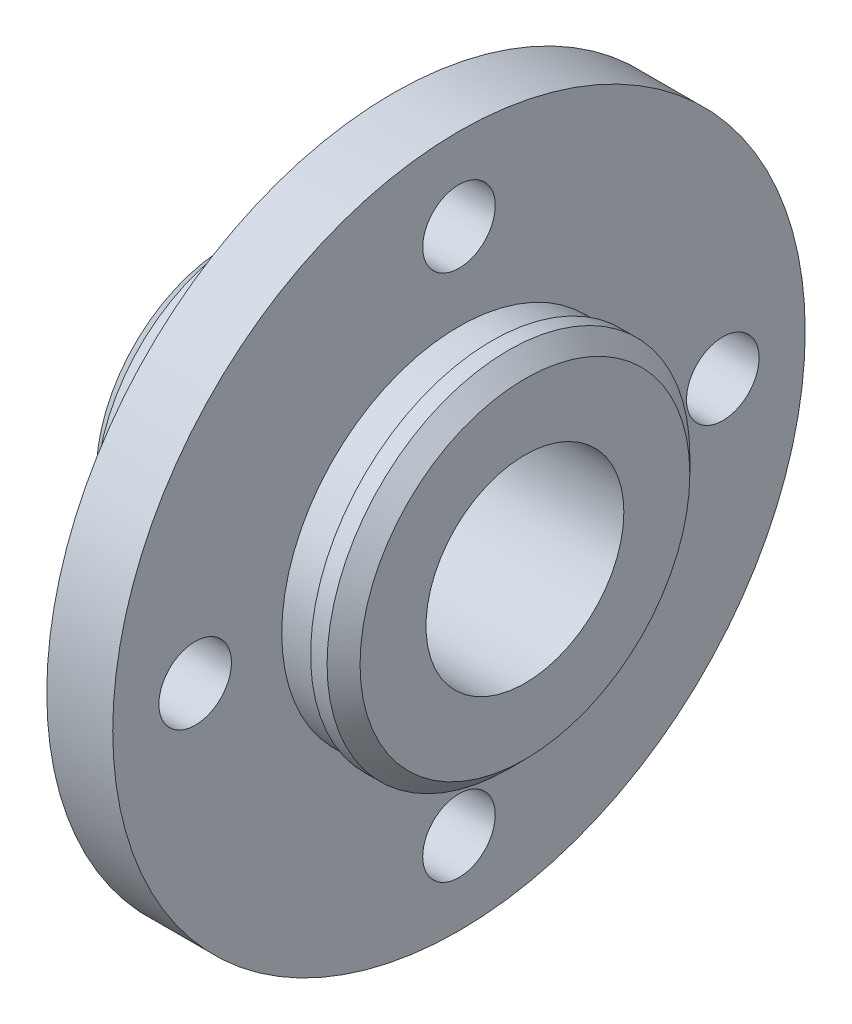
ISO-10303-21;
HEADER;
FILE_DESCRIPTION(('STEP AP214'),'2;1');
FILE_NAME('part.step','',(''),(''),'','','');
FILE_SCHEMA(('AUTOMOTIVE_DESIGN { 1 0 10303 214 1 1 1 1 }'));
ENDSEC;
DATA;
#1=APPLICATION_CONTEXT('core data for automotive mechanical design processes');
#2=APPLICATION_PROTOCOL_DEFINITION('international standard','automotive_design',2000,#1);
#3=PRODUCT_CONTEXT('',#1,'mechanical');
#4=PRODUCT('Part','Part','',(#3));
#5=PRODUCT_RELATED_PRODUCT_CATEGORY('part','',(#4));
#6=PRODUCT_DEFINITION_FORMATION('','',#4);
#7=PRODUCT_DEFINITION_CONTEXT('part definition',#1,'design');
#8=PRODUCT_DEFINITION('design','',#6,#7);
#9=PRODUCT_DEFINITION_SHAPE('','',#8);
#10=(LENGTH_UNIT() NAMED_UNIT(*) SI_UNIT(.MILLI.,.METRE.));
#11=(NAMED_UNIT(*) PLANE_ANGLE_UNIT() SI_UNIT($,.RADIAN.));
#12=(NAMED_UNIT(*) SI_UNIT($,.STERADIAN.) SOLID_ANGLE_UNIT());
#13=UNCERTAINTY_MEASURE_WITH_UNIT(LENGTH_MEASURE(1.E-05),#10,'distance_accuracy_value','');
#14=(GEOMETRIC_REPRESENTATION_CONTEXT(3) GLOBAL_UNCERTAINTY_ASSIGNED_CONTEXT((#13)) GLOBAL_UNIT_ASSIGNED_CONTEXT((#10,
#11,#12)) REPRESENTATION_CONTEXT('',''));
#15=CARTESIAN_POINT('',(0.,0.,0.));
#16=DIRECTION('',(0.,0.,1.));
#17=DIRECTION('',(1.,0.,0.));
#18=AXIS2_PLACEMENT_3D('',#15,#16,#17);
#19=CARTESIAN_POINT('',(0.,0.,0.));
#20=DIRECTION('',(1.,0.,0.));
#21=DIRECTION('',(0.,0.,-1.));
#22=AXIS2_PLACEMENT_3D('',#19,#20,#21);
#23=CYLINDRICAL_SURFACE('',#22,11.);
#24=CARTESIAN_POINT('',(-0.999999999999994,0.,0.));
#25=DIRECTION('',(-1.,0.,0.));
#26=DIRECTION('',(0.,0.,1.));
#27=AXIS2_PLACEMENT_3D('',#24,#25,#26);
#28=CIRCLE('',#27,11.);
#29=CARTESIAN_POINT('',(-0.999999999999994,0.,11.));
#30=VERTEX_POINT('',#29);
#31=EDGE_CURVE('E55',#30,#30,#28,.T.);
#32=ORIENTED_EDGE('',*,*,#31,.T.);
#33=EDGE_LOOP('',(#32));
#34=FACE_BOUND('',#33,.T.);
#35=CARTESIAN_POINT('',(-2.,0.,0.));
#36=DIRECTION('',(1.,0.,0.));
#37=DIRECTION('',(0.,0.,-1.));
#38=AXIS2_PLACEMENT_3D('',#35,#36,#37);
#39=CIRCLE('',#38,11.);
#40=CARTESIAN_POINT('',(-2.,0.,-11.));
#41=VERTEX_POINT('',#40);
#42=EDGE_CURVE('E70',#41,#41,#39,.T.);
#43=ORIENTED_EDGE('',*,*,#42,.T.);
#44=EDGE_LOOP('',(#43));
#45=FACE_BOUND('',#44,.T.);
#46=ADVANCED_FACE('F44',(#34,#45),#23,.T.);
#47=CARTESIAN_POINT('',(-2.,-11.,0.));
#48=DIRECTION('',(1.,0.,0.));
#49=DIRECTION('',(0.,0.,-1.));
#50=AXIS2_PLACEMENT_3D('',#47,#48,#49);
#51=PLANE('',#50);
#52=ORIENTED_EDGE('',*,*,#42,.F.);
#53=EDGE_LOOP('',(#52));
#54=FACE_BOUND('',#53,.T.);
#55=CARTESIAN_POINT('',(-2.,0.,0.));
#56=DIRECTION('',(1.,0.,0.));
#57=DIRECTION('',(0.,0.,-1.));
#58=AXIS2_PLACEMENT_3D('',#55,#56,#57);
#59=CIRCLE('',#58,10.75);
#60=CARTESIAN_POINT('',(-2.,0.,-10.75));
#61=VERTEX_POINT('',#60);
#62=EDGE_CURVE('E78',#61,#61,#59,.T.);
#63=ORIENTED_EDGE('',*,*,#62,.T.);
#64=EDGE_LOOP('',(#63));
#65=FACE_BOUND('',#64,.T.);
#66=ADVANCED_FACE('F152',(#54,#65),#51,.F.);
#67=CARTESIAN_POINT('',(0.,0.,0.));
#68=DIRECTION('',(1.,0.,0.));
#69=DIRECTION('',(0.,0.,-1.));
#70=AXIS2_PLACEMENT_3D('',#67,#68,#69);
#71=CYLINDRICAL_SURFACE('',#70,10.75);
#72=ORIENTED_EDGE('',*,*,#62,.F.);
#73=EDGE_LOOP('',(#72));
#74=FACE_BOUND('',#73,.T.);
#75=CARTESIAN_POINT('',(-4.,0.,0.));
#76=DIRECTION('',(1.,0.,0.));
#77=DIRECTION('',(0.,0.,-1.));
#78=AXIS2_PLACEMENT_3D('',#75,#76,#77);
#79=CIRCLE('',#78,10.75);
#80=CARTESIAN_POINT('',(-4.,0.,-10.75));
#81=VERTEX_POINT('',#80);
#82=EDGE_CURVE('E81',#81,#81,#79,.T.);
#83=ORIENTED_EDGE('',*,*,#82,.T.);
#84=EDGE_LOOP('',(#83));
#85=FACE_BOUND('',#84,.T.);
#86=ADVANCED_FACE('F123',(#74,#85),#71,.T.);
#87=CARTESIAN_POINT('',(-4.,-10.75,0.));
#88=DIRECTION('',(-1.,0.,0.));
#89=DIRECTION('',(0.,0.,1.));
#90=AXIS2_PLACEMENT_3D('',#87,#88,#89);
#91=PLANE('',#90);
#92=CARTESIAN_POINT('',(-4.,1.6759110426447E-13,-16.));
#93=DIRECTION('',(1.,0.,0.));
#94=DIRECTION('',(0.,-1.,0.));
#95=AXIS2_PLACEMENT_3D('',#92,#93,#94);
#96=CIRCLE('',#95,2.2);
#97=CARTESIAN_POINT('',(-4.,-2.19999999999983,-16.));
#98=VERTEX_POINT('',#97);
#99=EDGE_CURVE('E112',#98,#98,#96,.T.);
#100=ORIENTED_EDGE('',*,*,#99,.F.);
#101=EDGE_LOOP('',(#100));
#102=FACE_BOUND('',#101,.T.);
#103=CARTESIAN_POINT('',(-4.,-16.,0.));
#104=DIRECTION('',(1.,0.,0.));
#105=DIRECTION('',(0.,0.,1.));
#106=AXIS2_PLACEMENT_3D('',#103,#104,#105);
#107=CIRCLE('',#106,2.2);
#108=CARTESIAN_POINT('',(-4.,-16.,2.2));
#109=VERTEX_POINT('',#108);
#110=EDGE_CURVE('E106',#109,#109,#107,.T.);
#111=ORIENTED_EDGE('',*,*,#110,.F.);
#112=EDGE_LOOP('',(#111));
#113=FACE_BOUND('',#112,.T.);
#114=CARTESIAN_POINT('',(-4.,0.,16.));
#115=DIRECTION('',(1.,0.,0.));
#116=DIRECTION('',(0.,1.,0.));
#117=AXIS2_PLACEMENT_3D('',#114,#115,#116);
#118=CIRCLE('',#117,2.2);
#119=CARTESIAN_POINT('',(-4.,2.19999999999994,16.));
#120=VERTEX_POINT('',#119);
#121=EDGE_CURVE('E100',#120,#120,#118,.T.);
#122=ORIENTED_EDGE('',*,*,#121,.F.);
#123=EDGE_LOOP('',(#122));
#124=FACE_BOUND('',#123,.T.);
#125=CARTESIAN_POINT('',(-4.,16.,0.));
#126=DIRECTION('',(1.,0.,0.));
#127=DIRECTION('',(0.,0.,-1.));
#128=AXIS2_PLACEMENT_3D('',#125,#126,#127);
#129=CIRCLE('',#128,2.2);
#130=CARTESIAN_POINT('',(-4.,16.,-2.2));
#131=VERTEX_POINT('',#130);
#132=EDGE_CURVE('E75',#131,#131,#129,.T.);
#133=ORIENTED_EDGE('',*,*,#132,.F.);
#134=EDGE_LOOP('',(#133));
#135=FACE_BOUND('',#134,.T.);
#136=ORIENTED_EDGE('',*,*,#82,.F.);
#137=EDGE_LOOP('',(#136));
#138=FACE_BOUND('',#137,.T.);
#139=CARTESIAN_POINT('',(-4.,0.,0.));
#140=DIRECTION('',(1.,0.,0.));
#141=DIRECTION('',(0.,0.,-1.));
#142=AXIS2_PLACEMENT_3D('',#139,#140,#141);
#143=CIRCLE('',#142,21.);
#144=CARTESIAN_POINT('',(-4.,0.,-21.));
#145=VERTEX_POINT('',#144);
#146=EDGE_CURVE('E84',#145,#145,#143,.T.);
#147=ORIENTED_EDGE('',*,*,#146,.T.);
#148=EDGE_LOOP('',(#147));
#149=FACE_BOUND('',#148,.T.);
#150=ADVANCED_FACE('F119',(#102,#113,#124,#135,#138,#149),#91,.F.);
#151=CARTESIAN_POINT('',(0.,0.,0.));
#152=DIRECTION('',(1.,0.,0.));
#153=DIRECTION('',(0.,0.,-1.));
#154=AXIS2_PLACEMENT_3D('',#151,#152,#153);
#155=CYLINDRICAL_SURFACE('',#154,21.);
#156=ORIENTED_EDGE('',*,*,#146,.F.);
#157=EDGE_LOOP('',(#156));
#158=FACE_BOUND('',#157,.T.);
#159=CARTESIAN_POINT('',(-8.,0.,0.));
#160=DIRECTION('',(1.,0.,0.));
#161=DIRECTION('',(0.,0.,-1.));
#162=AXIS2_PLACEMENT_3D('',#159,#160,#161);
#163=CIRCLE('',#162,21.);
#164=CARTESIAN_POINT('',(-8.,0.,-21.));
#165=VERTEX_POINT('',#164);
#166=EDGE_CURVE('E87',#165,#165,#163,.T.);
#167=ORIENTED_EDGE('',*,*,#166,.T.);
#168=EDGE_LOOP('',(#167));
#169=FACE_BOUND('',#168,.T.);
#170=ADVANCED_FACE('F122',(#158,#169),#155,.T.);
#171=CARTESIAN_POINT('',(-8.,-21.,0.));
#172=DIRECTION('',(1.,0.,0.));
#173=DIRECTION('',(0.,0.,-1.));
#174=AXIS2_PLACEMENT_3D('',#171,#172,#173);
#175=PLANE('',#174);
#176=CARTESIAN_POINT('',(-8.,0.,0.));
#177=DIRECTION('',(1.,0.,0.));
#178=DIRECTION('',(0.,0.,-1.));
#179=AXIS2_PLACEMENT_3D('',#176,#177,#178);
#180=CIRCLE('',#179,10.);
#181=CARTESIAN_POINT('',(-8.,0.,-10.));
#182=VERTEX_POINT('',#181);
#183=EDGE_CURVE('E67',#182,#182,#180,.T.);
#184=ORIENTED_EDGE('',*,*,#183,.T.);
#185=EDGE_LOOP('',(#184));
#186=FACE_BOUND('',#185,.T.);
#187=CARTESIAN_POINT('',(-8.,1.6759110426447E-13,-16.));
#188=DIRECTION('',(1.,0.,0.));
#189=DIRECTION('',(0.,-1.,0.));
#190=AXIS2_PLACEMENT_3D('',#187,#188,#189);
#191=CIRCLE('',#190,2.2);
#192=CARTESIAN_POINT('',(-8.,-2.19999999999983,-16.));
#193=VERTEX_POINT('',#192);
#194=EDGE_CURVE('E109',#193,#193,#191,.T.);
#195=ORIENTED_EDGE('',*,*,#194,.T.);
#196=EDGE_LOOP('',(#195));
#197=FACE_BOUND('',#196,.T.);
#198=CARTESIAN_POINT('',(-8.,-16.,0.));
#199=DIRECTION('',(1.,0.,0.));
#200=DIRECTION('',(0.,0.,1.));
#201=AXIS2_PLACEMENT_3D('',#198,#199,#200);
#202=CIRCLE('',#201,2.2);
#203=CARTESIAN_POINT('',(-8.,-16.,2.2));
#204=VERTEX_POINT('',#203);
#205=EDGE_CURVE('E103',#204,#204,#202,.T.);
#206=ORIENTED_EDGE('',*,*,#205,.T.);
#207=EDGE_LOOP('',(#206));
#208=FACE_BOUND('',#207,.T.);
#209=CARTESIAN_POINT('',(-8.,0.,16.));
#210=DIRECTION('',(1.,0.,0.));
#211=DIRECTION('',(0.,1.,0.));
#212=AXIS2_PLACEMENT_3D('',#209,#210,#211);
#213=CIRCLE('',#212,2.2);
#214=CARTESIAN_POINT('',(-8.,2.19999999999994,16.));
#215=VERTEX_POINT('',#214);
#216=EDGE_CURVE('E97',#215,#215,#213,.T.);
#217=ORIENTED_EDGE('',*,*,#216,.T.);
#218=EDGE_LOOP('',(#217));
#219=FACE_BOUND('',#218,.T.);
#220=CARTESIAN_POINT('',(-8.,16.,0.));
#221=DIRECTION('',(1.,0.,0.));
#222=DIRECTION('',(0.,0.,-1.));
#223=AXIS2_PLACEMENT_3D('',#220,#221,#222);
#224=CIRCLE('',#223,2.2);
#225=CARTESIAN_POINT('',(-8.,16.,-2.2));
#226=VERTEX_POINT('',#225);
#227=EDGE_CURVE('E71',#226,#226,#224,.T.);
#228=ORIENTED_EDGE('',*,*,#227,.T.);
#229=EDGE_LOOP('',(#228));
#230=FACE_BOUND('',#229,.T.);
#231=ORIENTED_EDGE('',*,*,#166,.F.);
#232=EDGE_LOOP('',(#231));
#233=FACE_BOUND('',#232,.T.);
#234=ADVANCED_FACE('F137',(#186,#197,#208,#219,#230,#233),#175,.F.);
#235=CARTESIAN_POINT('',(0.,0.,0.));
#236=DIRECTION('',(1.,0.,0.));
#237=DIRECTION('',(0.,0.,-1.));
#238=AXIS2_PLACEMENT_3D('',#235,#236,#237);
#239=CYLINDRICAL_SURFACE('',#238,9.);
#240=CARTESIAN_POINT('',(-17.,0.,0.));
#241=DIRECTION('',(1.,0.,0.));
#242=DIRECTION('',(0.,0.,-1.));
#243=AXIS2_PLACEMENT_3D('',#240,#241,#242);
#244=CIRCLE('',#243,9.);
#245=CARTESIAN_POINT('',(-17.,0.,-9.));
#246=VERTEX_POINT('',#245);
#247=EDGE_CURVE('E51',#246,#246,#244,.T.);
#248=ORIENTED_EDGE('',*,*,#247,.T.);
#249=EDGE_LOOP('',(#248));
#250=FACE_BOUND('',#249,.T.);
#251=CARTESIAN_POINT('',(-9.,0.,0.));
#252=DIRECTION('',(1.,0.,0.));
#253=DIRECTION('',(0.,0.,-1.));
#254=AXIS2_PLACEMENT_3D('',#251,#252,#253);
#255=CIRCLE('',#254,9.);
#256=CARTESIAN_POINT('',(-9.,0.,-9.));
#257=VERTEX_POINT('',#256);
#258=EDGE_CURVE('E64',#257,#257,#255,.F.);
#259=ORIENTED_EDGE('',*,*,#258,.T.);
#260=EDGE_LOOP('',(#259));
#261=FACE_BOUND('',#260,.T.);
#262=ADVANCED_FACE('F142',(#250,#261),#239,.T.);
#263=CARTESIAN_POINT('',(-18.,-9.,0.));
#264=DIRECTION('',(1.,0.,0.));
#265=DIRECTION('',(0.,0.,-1.));
#266=AXIS2_PLACEMENT_3D('',#263,#264,#265);
#267=PLANE('',#266);
#268=CARTESIAN_POINT('',(-18.,0.,0.));
#269=DIRECTION('',(1.,0.,0.));
#270=DIRECTION('',(0.,0.,-1.));
#271=AXIS2_PLACEMENT_3D('',#268,#269,#270);
#272=CIRCLE('',#271,7.99999999999999);
#273=CARTESIAN_POINT('',(-18.,0.,-7.99999999999999));
#274=VERTEX_POINT('',#273);
#275=EDGE_CURVE('E12',#274,#274,#272,.F.);
#276=ORIENTED_EDGE('',*,*,#275,.T.);
#277=EDGE_LOOP('',(#276));
#278=FACE_BOUND('',#277,.T.);
#279=CARTESIAN_POINT('',(-18.,0.,0.));
#280=DIRECTION('',(1.,0.,0.));
#281=DIRECTION('',(0.,0.,-1.));
#282=AXIS2_PLACEMENT_3D('',#279,#280,#281);
#283=CIRCLE('',#282,6.);
#284=CARTESIAN_POINT('',(-18.,0.,-6.));
#285=VERTEX_POINT('',#284);
#286=EDGE_CURVE('E90',#285,#285,#283,.T.);
#287=ORIENTED_EDGE('',*,*,#286,.T.);
#288=EDGE_LOOP('',(#287));
#289=FACE_BOUND('',#288,.T.);
#290=ADVANCED_FACE('F148',(#278,#289),#267,.F.);
#291=CARTESIAN_POINT('',(0.,0.,0.));
#292=DIRECTION('',(1.,0.,0.));
#293=DIRECTION('',(0.,0.,-1.));
#294=AXIS2_PLACEMENT_3D('',#291,#292,#293);
#295=CYLINDRICAL_SURFACE('',#294,6.);
#296=ORIENTED_EDGE('',*,*,#286,.F.);
#297=EDGE_LOOP('',(#296));
#298=FACE_BOUND('',#297,.T.);
#299=CARTESIAN_POINT('',(0.,0.,0.));
#300=DIRECTION('',(1.,0.,0.));
#301=DIRECTION('',(0.,0.,-1.));
#302=AXIS2_PLACEMENT_3D('',#299,#300,#301);
#303=CIRCLE('',#302,6.);
#304=CARTESIAN_POINT('',(0.,0.,-6.));
#305=VERTEX_POINT('',#304);
#306=EDGE_CURVE('E74',#305,#305,#303,.T.);
#307=ORIENTED_EDGE('',*,*,#306,.T.);
#308=EDGE_LOOP('',(#307));
#309=FACE_BOUND('',#308,.T.);
#310=ADVANCED_FACE('F181',(#298,#309),#295,.F.);
#311=CARTESIAN_POINT('',(0.,-6.,0.));
#312=DIRECTION('',(-1.,0.,0.));
#313=DIRECTION('',(0.,0.,1.));
#314=AXIS2_PLACEMENT_3D('',#311,#312,#313);
#315=PLANE('',#314);
#316=CARTESIAN_POINT('',(0.,0.,0.));
#317=DIRECTION('',(-1.,0.,0.));
#318=DIRECTION('',(0.,0.,1.));
#319=AXIS2_PLACEMENT_3D('',#316,#317,#318);
#320=CIRCLE('',#319,10.);
#321=CARTESIAN_POINT('',(0.,0.,10.));
#322=VERTEX_POINT('',#321);
#323=EDGE_CURVE('E59',#322,#322,#320,.F.);
#324=ORIENTED_EDGE('',*,*,#323,.T.);
#325=EDGE_LOOP('',(#324));
#326=FACE_BOUND('',#325,.T.);
#327=ORIENTED_EDGE('',*,*,#306,.F.);
#328=EDGE_LOOP('',(#327));
#329=FACE_BOUND('',#328,.T.);
#330=ADVANCED_FACE('F177',(#326,#329),#315,.F.);
#331=CARTESIAN_POINT('',(-18.,16.,0.));
#332=DIRECTION('',(1.,0.,0.));
#333=DIRECTION('',(0.,0.,-1.));
#334=AXIS2_PLACEMENT_3D('',#331,#332,#333);
#335=CYLINDRICAL_SURFACE('',#334,2.2);
#336=ORIENTED_EDGE('',*,*,#132,.T.);
#337=EDGE_LOOP('',(#336));
#338=FACE_BOUND('',#337,.T.);
#339=ORIENTED_EDGE('',*,*,#227,.F.);
#340=EDGE_LOOP('',(#339));
#341=FACE_BOUND('',#340,.T.);
#342=ADVANCED_FACE('F180',(#338,#341),#335,.F.);
#343=CARTESIAN_POINT('',(-18.,0.,16.));
#344=DIRECTION('',(1.,0.,0.));
#345=DIRECTION('',(0.,1.,0.));
#346=AXIS2_PLACEMENT_3D('',#343,#344,#345);
#347=CYLINDRICAL_SURFACE('',#346,2.2);
#348=ORIENTED_EDGE('',*,*,#121,.T.);
#349=EDGE_LOOP('',(#348));
#350=FACE_BOUND('',#349,.T.);
#351=ORIENTED_EDGE('',*,*,#216,.F.);
#352=EDGE_LOOP('',(#351));
#353=FACE_BOUND('',#352,.T.);
#354=ADVANCED_FACE('F196',(#350,#353),#347,.F.);
#355=CARTESIAN_POINT('',(-18.,-16.,0.));
#356=DIRECTION('',(1.,0.,0.));
#357=DIRECTION('',(0.,0.,1.));
#358=AXIS2_PLACEMENT_3D('',#355,#356,#357);
#359=CYLINDRICAL_SURFACE('',#358,2.2);
#360=ORIENTED_EDGE('',*,*,#110,.T.);
#361=EDGE_LOOP('',(#360));
#362=FACE_BOUND('',#361,.T.);
#363=ORIENTED_EDGE('',*,*,#205,.F.);
#364=EDGE_LOOP('',(#363));
#365=FACE_BOUND('',#364,.T.);
#366=ADVANCED_FACE('F200',(#362,#365),#359,.F.);
#367=CARTESIAN_POINT('',(-18.,1.6759110426447E-13,-16.));
#368=DIRECTION('',(1.,0.,0.));
#369=DIRECTION('',(0.,-1.,0.));
#370=AXIS2_PLACEMENT_3D('',#367,#368,#369);
#371=CYLINDRICAL_SURFACE('',#370,2.2);
#372=ORIENTED_EDGE('',*,*,#99,.T.);
#373=EDGE_LOOP('',(#372));
#374=FACE_BOUND('',#373,.T.);
#375=ORIENTED_EDGE('',*,*,#194,.F.);
#376=EDGE_LOOP('',(#375));
#377=FACE_BOUND('',#376,.T.);
#378=ADVANCED_FACE('F116',(#374,#377),#371,.F.);
#379=CARTESIAN_POINT('',(-9.,0.,0.));
#380=DIRECTION('',(1.,0.,0.));
#381=DIRECTION('',(0.,0.,-1.));
#382=AXIS2_PLACEMENT_3D('',#379,#380,#381);
#383=TOROIDAL_SURFACE('',#382,10.,1.);
#384=ORIENTED_EDGE('',*,*,#258,.F.);
#385=EDGE_LOOP('',(#384));
#386=FACE_BOUND('',#385,.T.);
#387=ORIENTED_EDGE('',*,*,#183,.F.);
#388=EDGE_LOOP('',(#387));
#389=FACE_BOUND('',#388,.T.);
#390=ADVANCED_FACE('F163',(#386,#389),#383,.F.);
#391=CARTESIAN_POINT('',(0.,0.,0.));
#392=DIRECTION('',(-1.,0.,0.));
#393=DIRECTION('',(0.,0.,1.));
#394=AXIS2_PLACEMENT_3D('',#391,#392,#393);
#395=CONICAL_SURFACE('',#394,10.,0.78539816339745);
#396=ORIENTED_EDGE('',*,*,#31,.F.);
#397=EDGE_LOOP('',(#396));
#398=FACE_BOUND('',#397,.T.);
#399=ORIENTED_EDGE('',*,*,#323,.F.);
#400=EDGE_LOOP('',(#399));
#401=FACE_BOUND('',#400,.T.);
#402=ADVANCED_FACE('F165',(#398,#401),#395,.T.);
#403=CARTESIAN_POINT('',(-17.,0.,0.));
#404=DIRECTION('',(1.,0.,0.));
#405=DIRECTION('',(0.,0.,-1.));
#406=AXIS2_PLACEMENT_3D('',#403,#404,#405);
#407=CONICAL_SURFACE('',#406,9.,0.78539816339745);
#408=ORIENTED_EDGE('',*,*,#275,.F.);
#409=EDGE_LOOP('',(#408));
#410=FACE_BOUND('',#409,.T.);
#411=ORIENTED_EDGE('',*,*,#247,.F.);
#412=EDGE_LOOP('',(#411));
#413=FACE_BOUND('',#412,.T.);
#414=ADVANCED_FACE('F46',(#410,#413),#407,.T.);
#415=CLOSED_SHELL('',(#46,#66,#86,#150,#170,#234,#262,#290,#310,#330,#342,#354,#366,#378,#390,
#402,#414));
#416=MANIFOLD_SOLID_BREP('B2',#415);
#417=ADVANCED_BREP_SHAPE_REPRESENTATION('',(#18,#416),#14);
#418=SHAPE_DEFINITION_REPRESENTATION(#9,#417);
ENDSEC;
END-ISO-10303-21;
